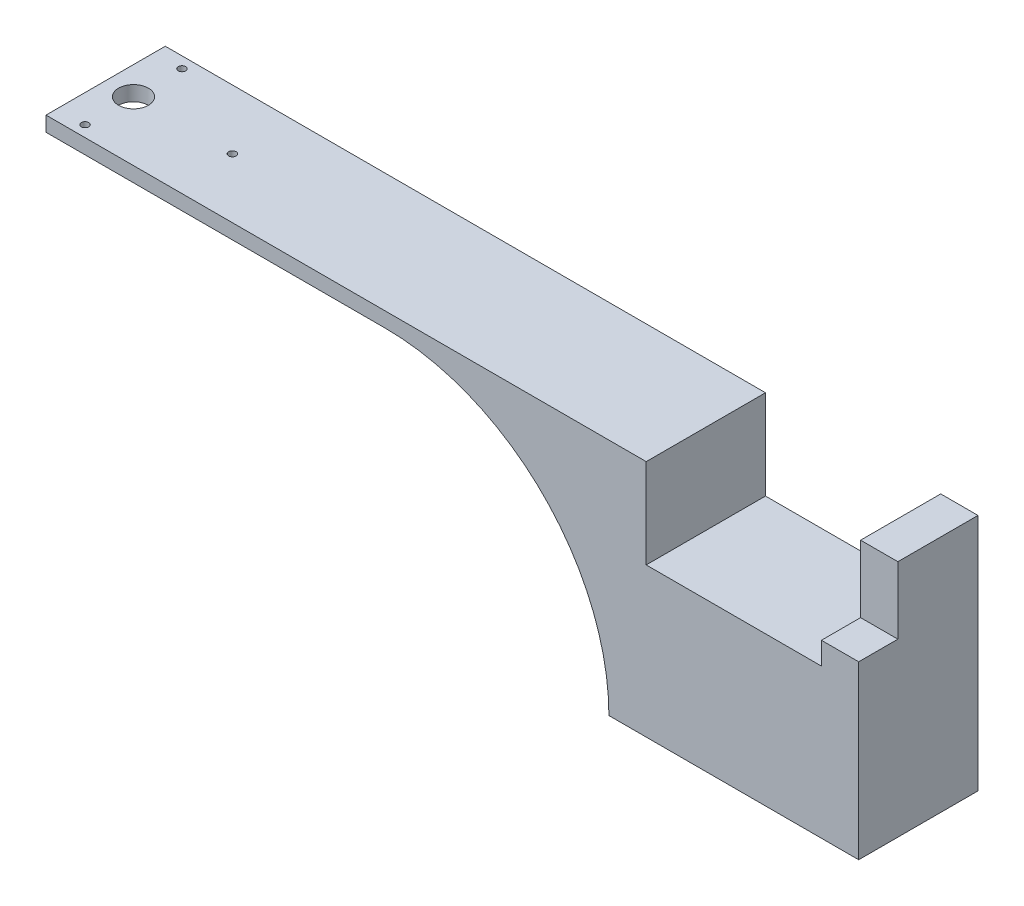
ISO-10303-21;
HEADER;
FILE_DESCRIPTION(('STEP AP214'),'2;1');
FILE_NAME('part.step','',(''),(''),'','','');
FILE_SCHEMA(('AUTOMOTIVE_DESIGN { 1 0 10303 214 1 1 1 1 }'));
ENDSEC;
DATA;
#1=APPLICATION_CONTEXT('core data for automotive mechanical design processes');
#2=APPLICATION_PROTOCOL_DEFINITION('international standard','automotive_design',2000,#1);
#3=PRODUCT_CONTEXT('',#1,'mechanical');
#4=PRODUCT('Part','Part','',(#3));
#5=PRODUCT_RELATED_PRODUCT_CATEGORY('part','',(#4));
#6=PRODUCT_DEFINITION_FORMATION('','',#4);
#7=PRODUCT_DEFINITION_CONTEXT('part definition',#1,'design');
#8=PRODUCT_DEFINITION('design','',#6,#7);
#9=PRODUCT_DEFINITION_SHAPE('','',#8);
#10=(LENGTH_UNIT() NAMED_UNIT(*) SI_UNIT(.MILLI.,.METRE.));
#11=(NAMED_UNIT(*) PLANE_ANGLE_UNIT() SI_UNIT($,.RADIAN.));
#12=(NAMED_UNIT(*) SI_UNIT($,.STERADIAN.) SOLID_ANGLE_UNIT());
#13=UNCERTAINTY_MEASURE_WITH_UNIT(LENGTH_MEASURE(1.E-05),#10,'distance_accuracy_value','');
#14=(GEOMETRIC_REPRESENTATION_CONTEXT(3) GLOBAL_UNCERTAINTY_ASSIGNED_CONTEXT((#13)) GLOBAL_UNIT_ASSIGNED_CONTEXT((#10,
#11,#12)) REPRESENTATION_CONTEXT('',''));
#15=CARTESIAN_POINT('',(0.,0.,0.));
#16=DIRECTION('',(0.,0.,1.));
#17=DIRECTION('',(1.,0.,0.));
#18=AXIS2_PLACEMENT_3D('',#15,#16,#17);
#19=CARTESIAN_POINT('',(0.,32.,0.));
#20=DIRECTION('',(0.,1.,0.));
#21=DIRECTION('',(0.,0.,1.));
#22=AXIS2_PLACEMENT_3D('',#19,#20,#21);
#23=PLANE('',#22);
#24=CARTESIAN_POINT('',(-88.5159746639612,32.,-6.5));
#25=DIRECTION('',(0.,1.,0.));
#26=DIRECTION('',(0.,0.,1.));
#27=AXIS2_PLACEMENT_3D('',#24,#25,#26);
#28=CIRCLE('',#27,0.499999999999999);
#29=CARTESIAN_POINT('',(-88.5159746639612,32.,-6.));
#30=VERTEX_POINT('',#29);
#31=EDGE_CURVE('E223',#30,#30,#28,.T.);
#32=ORIENTED_EDGE('',*,*,#31,.F.);
#33=EDGE_LOOP('',(#32));
#34=FACE_BOUND('',#33,.T.);
#35=CARTESIAN_POINT('',(-88.5159746639612,32.,0.));
#36=DIRECTION('',(0.,1.,0.));
#37=DIRECTION('',(0.,0.,1.));
#38=AXIS2_PLACEMENT_3D('',#35,#36,#37);
#39=CIRCLE('',#38,2.);
#40=CARTESIAN_POINT('',(-88.5159746639612,32.,2.));
#41=VERTEX_POINT('',#40);
#42=EDGE_CURVE('E608',#41,#41,#39,.T.);
#43=ORIENTED_EDGE('',*,*,#42,.F.);
#44=EDGE_LOOP('',(#43));
#45=FACE_BOUND('',#44,.T.);
#46=CARTESIAN_POINT('',(-88.5159746639612,32.,6.5));
#47=DIRECTION('',(0.,1.,0.));
#48=DIRECTION('',(0.,0.,-1.));
#49=AXIS2_PLACEMENT_3D('',#46,#47,#48);
#50=CIRCLE('',#49,0.499999999999999);
#51=CARTESIAN_POINT('',(-88.5159746639612,32.,6.));
#52=VERTEX_POINT('',#51);
#53=EDGE_CURVE('E337',#52,#52,#50,.T.);
#54=ORIENTED_EDGE('',*,*,#53,.F.);
#55=EDGE_LOOP('',(#54));
#56=FACE_BOUND('',#55,.T.);
#57=CARTESIAN_POINT('',(-75.2500000000001,32.,0.));
#58=DIRECTION('',(0.,1.,0.));
#59=DIRECTION('',(0.,0.,1.));
#60=AXIS2_PLACEMENT_3D('',#57,#58,#59);
#61=CIRCLE('',#60,0.499999999999999);
#62=CARTESIAN_POINT('',(-75.2500000000001,32.,0.499999999999999));
#63=VERTEX_POINT('',#62);
#64=EDGE_CURVE('E598',#63,#63,#61,.T.);
#65=ORIENTED_EDGE('',*,*,#64,.F.);
#66=EDGE_LOOP('',(#65));
#67=FACE_BOUND('',#66,.T.);
#68=DIRECTION('',(0.,0.,1.));
#69=VECTOR('',#68,1.);
#70=CARTESIAN_POINT('',(-11.75,32.,8.));
#71=LINE('',#70,#69);
#72=CARTESIAN_POINT('',(-11.75,32.,-8.));
#73=VERTEX_POINT('',#72);
#74=CARTESIAN_POINT('',(-11.75,32.,8.));
#75=VERTEX_POINT('',#74);
#76=EDGE_CURVE('E254',#73,#75,#71,.T.);
#77=ORIENTED_EDGE('',*,*,#76,.F.);
#78=DIRECTION('',(-1.,0.,0.));
#79=VECTOR('',#78,1.);
#80=CARTESIAN_POINT('',(16.75,32.,-8.));
#81=LINE('',#80,#79);
#82=CARTESIAN_POINT('',(-92.2500000000001,32.,-7.99999999999997));
#83=VERTEX_POINT('',#82);
#84=EDGE_CURVE('E173',#73,#83,#81,.T.);
#85=ORIENTED_EDGE('',*,*,#84,.T.);
#86=DIRECTION('',(0.,0.,-1.));
#87=VECTOR('',#86,1.);
#88=CARTESIAN_POINT('',(-92.2500000000001,32.,-7.99999999999997));
#89=LINE('',#88,#87);
#90=CARTESIAN_POINT('',(-92.2500000000001,32.,8.00000000000003));
#91=VERTEX_POINT('',#90);
#92=EDGE_CURVE('E260',#91,#83,#89,.T.);
#93=ORIENTED_EDGE('',*,*,#92,.F.);
#94=DIRECTION('',(1.,0.,0.));
#95=VECTOR('',#94,1.);
#96=CARTESIAN_POINT('',(16.75,32.,7.99999999999999));
#97=LINE('',#96,#95);
#98=EDGE_CURVE('E179',#91,#75,#97,.T.);
#99=ORIENTED_EDGE('',*,*,#98,.T.);
#100=EDGE_LOOP('',(#77,#85,#93,#99));
#101=FACE_BOUND('',#100,.T.);
#102=ADVANCED_FACE('F39',(#34,#45,#56,#67,#101),#23,.T.);
#103=CARTESIAN_POINT('',(16.75,32.,7.99999999999999));
#104=DIRECTION('',(-1.,0.,0.));
#105=DIRECTION('',(0.,0.,1.));
#106=AXIS2_PLACEMENT_3D('',#103,#104,#105);
#107=PLANE('',#106);
#108=DIRECTION('',(0.,0.,-1.));
#109=VECTOR('',#108,1.);
#110=CARTESIAN_POINT('',(16.75,32.,7.99999999999999));
#111=LINE('',#110,#109);
#112=CARTESIAN_POINT('',(16.75,32.,2.74736434071692));
#113=VERTEX_POINT('',#112);
#114=CARTESIAN_POINT('',(16.75,32.,-8.));
#115=VERTEX_POINT('',#114);
#116=EDGE_CURVE('E170',#113,#115,#111,.T.);
#117=ORIENTED_EDGE('',*,*,#116,.F.);
#118=DIRECTION('',(0.,1.,0.));
#119=VECTOR('',#118,1.);
#120=CARTESIAN_POINT('',(16.75,23.,2.74736434071692));
#121=LINE('',#120,#119);
#122=CARTESIAN_POINT('',(16.75,23.,2.74736434071692));
#123=VERTEX_POINT('',#122);
#124=EDGE_CURVE('E298',#123,#113,#121,.T.);
#125=ORIENTED_EDGE('',*,*,#124,.F.);
#126=DIRECTION('',(0.,0.,-1.));
#127=VECTOR('',#126,1.);
#128=CARTESIAN_POINT('',(16.75,23.,7.99999999999999));
#129=LINE('',#128,#127);
#130=CARTESIAN_POINT('',(16.75,23.,7.99999999999999));
#131=VERTEX_POINT('',#130);
#132=EDGE_CURVE('E150',#131,#123,#129,.T.);
#133=ORIENTED_EDGE('',*,*,#132,.F.);
#134=DIRECTION('',(0.,-1.,0.));
#135=VECTOR('',#134,1.);
#136=CARTESIAN_POINT('',(16.75,32.,7.99999999999999));
#137=LINE('',#136,#135);
#138=CARTESIAN_POINT('',(16.75,0.,7.99999999999999));
#139=VERTEX_POINT('',#138);
#140=EDGE_CURVE('E148',#131,#139,#137,.T.);
#141=ORIENTED_EDGE('',*,*,#140,.T.);
#142=DIRECTION('',(0.,0.,-1.));
#143=VECTOR('',#142,1.);
#144=CARTESIAN_POINT('',(16.75,0.,7.99999999999999));
#145=LINE('',#144,#143);
#146=CARTESIAN_POINT('',(16.75,0.,-8.));
#147=VERTEX_POINT('',#146);
#148=EDGE_CURVE('E183',#139,#147,#145,.T.);
#149=ORIENTED_EDGE('',*,*,#148,.T.);
#150=DIRECTION('',(0.,-1.,0.));
#151=VECTOR('',#150,1.);
#152=CARTESIAN_POINT('',(16.75,32.,-8.));
#153=LINE('',#152,#151);
#154=EDGE_CURVE('E197',#115,#147,#153,.T.);
#155=ORIENTED_EDGE('',*,*,#154,.F.);
#156=EDGE_LOOP('',(#117,#125,#133,#141,#149,#155));
#157=FACE_BOUND('',#156,.T.);
#158=ADVANCED_FACE('F317',(#157),#107,.F.);
#159=CARTESIAN_POINT('',(16.75,32.,-8.));
#160=DIRECTION('',(0.,0.,1.));
#161=DIRECTION('',(1.,0.,0.));
#162=AXIS2_PLACEMENT_3D('',#159,#160,#161);
#163=PLANE('',#162);
#164=CARTESIAN_POINT('',(13.65,26.,-8.));
#165=DIRECTION('',(0.,0.,1.));
#166=DIRECTION('',(1.,0.,0.));
#167=AXIS2_PLACEMENT_3D('',#164,#165,#166);
#168=CIRCLE('',#167,0.8);
#169=CARTESIAN_POINT('',(14.45,26.,-8.));
#170=VERTEX_POINT('',#169);
#171=EDGE_CURVE('E324',#170,#170,#168,.T.);
#172=ORIENTED_EDGE('',*,*,#171,.T.);
#173=EDGE_LOOP('',(#172));
#174=FACE_BOUND('',#173,.T.);
#175=CARTESIAN_POINT('',(-13.65,26.,-8.));
#176=DIRECTION('',(0.,0.,1.));
#177=DIRECTION('',(1.,0.,0.));
#178=AXIS2_PLACEMENT_3D('',#175,#176,#177);
#179=CIRCLE('',#178,0.8);
#180=CARTESIAN_POINT('',(-12.85,26.,-8.));
#181=VERTEX_POINT('',#180);
#182=EDGE_CURVE('E334',#181,#181,#179,.T.);
#183=ORIENTED_EDGE('',*,*,#182,.T.);
#184=EDGE_LOOP('',(#183));
#185=FACE_BOUND('',#184,.T.);
#186=ORIENTED_EDGE('',*,*,#84,.F.);
#187=DIRECTION('',(0.,1.,0.));
#188=VECTOR('',#187,1.);
#189=CARTESIAN_POINT('',(-11.75,20.,-8.));
#190=LINE('',#189,#188);
#191=CARTESIAN_POINT('',(-11.75,20.,-8.));
#192=VERTEX_POINT('',#191);
#193=EDGE_CURVE('E163',#192,#73,#190,.T.);
#194=ORIENTED_EDGE('',*,*,#193,.F.);
#195=DIRECTION('',(-1.,0.,0.));
#196=VECTOR('',#195,1.);
#197=CARTESIAN_POINT('',(-11.75,20.,-8.));
#198=LINE('',#197,#196);
#199=CARTESIAN_POINT('',(11.75,20.,-8.));
#200=VERTEX_POINT('',#199);
#201=EDGE_CURVE('E166',#200,#192,#198,.T.);
#202=ORIENTED_EDGE('',*,*,#201,.F.);
#203=DIRECTION('',(0.,1.,0.));
#204=VECTOR('',#203,1.);
#205=CARTESIAN_POINT('',(11.75,20.,-8.));
#206=LINE('',#205,#204);
#207=CARTESIAN_POINT('',(11.75,32.,-8.));
#208=VERTEX_POINT('',#207);
#209=EDGE_CURVE('E157',#200,#208,#206,.T.);
#210=ORIENTED_EDGE('',*,*,#209,.T.);
#211=EDGE_CURVE('E175',#115,#208,#81,.T.);
#212=ORIENTED_EDGE('',*,*,#211,.F.);
#213=ORIENTED_EDGE('',*,*,#154,.T.);
#214=DIRECTION('',(-1.,0.,0.));
#215=VECTOR('',#214,1.);
#216=CARTESIAN_POINT('',(16.75,0.,-8.));
#217=LINE('',#216,#215);
#218=CARTESIAN_POINT('',(-16.75,0.,-8.00000000000001));
#219=VERTEX_POINT('',#218);
#220=EDGE_CURVE('E187',#147,#219,#217,.T.);
#221=ORIENTED_EDGE('',*,*,#220,.T.);
#222=CARTESIAN_POINT('',(-46.75,0.,-8.00000000000001));
#223=DIRECTION('',(0.,0.,1.));
#224=DIRECTION('',(1.,0.,0.));
#225=AXIS2_PLACEMENT_3D('',#222,#223,#224);
#226=CIRCLE('',#225,30.);
#227=CARTESIAN_POINT('',(-46.75,30.,-7.99999999999999));
#228=VERTEX_POINT('',#227);
#229=EDGE_CURVE('E11',#219,#228,#226,.T.);
#230=ORIENTED_EDGE('',*,*,#229,.T.);
#231=DIRECTION('',(1.,0.,0.));
#232=VECTOR('',#231,1.);
#233=CARTESIAN_POINT('',(-92.2500000000001,30.,-7.99999999999997));
#234=LINE('',#233,#232);
#235=CARTESIAN_POINT('',(-92.2500000000001,30.,-7.99999999999997));
#236=VERTEX_POINT('',#235);
#237=EDGE_CURVE('E249',#236,#228,#234,.T.);
#238=ORIENTED_EDGE('',*,*,#237,.F.);
#239=DIRECTION('',(0.,-1.,0.));
#240=VECTOR('',#239,1.);
#241=CARTESIAN_POINT('',(-92.2500000000001,32.,-7.99999999999997));
#242=LINE('',#241,#240);
#243=EDGE_CURVE('E288',#83,#236,#242,.T.);
#244=ORIENTED_EDGE('',*,*,#243,.F.);
#245=EDGE_LOOP('',(#186,#194,#202,#210,#212,#213,#221,#230,#238,#244));
#246=FACE_BOUND('',#245,.T.);
#247=ADVANCED_FACE('F287',(#174,#185,#246),#163,.F.);
#248=CARTESIAN_POINT('',(16.75,32.,7.99999999999999));
#249=DIRECTION('',(0.,0.,-1.));
#250=DIRECTION('',(-1.,0.,0.));
#251=AXIS2_PLACEMENT_3D('',#248,#249,#250);
#252=PLANE('',#251);
#253=ORIENTED_EDGE('',*,*,#140,.F.);
#254=DIRECTION('',(1.,0.,0.));
#255=VECTOR('',#254,1.);
#256=CARTESIAN_POINT('',(11.75,23.,7.99999999999999));
#257=LINE('',#256,#255);
#258=CARTESIAN_POINT('',(11.75,23.,7.99999999999999));
#259=VERTEX_POINT('',#258);
#260=EDGE_CURVE('E130',#259,#131,#257,.T.);
#261=ORIENTED_EDGE('',*,*,#260,.F.);
#262=DIRECTION('',(0.,1.,0.));
#263=VECTOR('',#262,1.);
#264=CARTESIAN_POINT('',(11.75,20.,8.));
#265=LINE('',#264,#263);
#266=CARTESIAN_POINT('',(11.75,20.,8.));
#267=VERTEX_POINT('',#266);
#268=EDGE_CURVE('E146',#267,#259,#265,.T.);
#269=ORIENTED_EDGE('',*,*,#268,.F.);
#270=DIRECTION('',(1.,0.,0.));
#271=VECTOR('',#270,1.);
#272=CARTESIAN_POINT('',(-11.75,20.,8.));
#273=LINE('',#272,#271);
#274=CARTESIAN_POINT('',(-11.75,20.,8.));
#275=VERTEX_POINT('',#274);
#276=EDGE_CURVE('E268',#275,#267,#273,.T.);
#277=ORIENTED_EDGE('',*,*,#276,.F.);
#278=DIRECTION('',(0.,1.,0.));
#279=VECTOR('',#278,1.);
#280=CARTESIAN_POINT('',(-11.75,20.,8.));
#281=LINE('',#280,#279);
#282=EDGE_CURVE('E158',#275,#75,#281,.T.);
#283=ORIENTED_EDGE('',*,*,#282,.T.);
#284=ORIENTED_EDGE('',*,*,#98,.F.);
#285=DIRECTION('',(0.,1.,0.));
#286=VECTOR('',#285,1.);
#287=CARTESIAN_POINT('',(-92.2500000000001,32.,8.00000000000003));
#288=LINE('',#287,#286);
#289=CARTESIAN_POINT('',(-92.2500000000001,30.,8.00000000000003));
#290=VERTEX_POINT('',#289);
#291=EDGE_CURVE('E296',#290,#91,#288,.T.);
#292=ORIENTED_EDGE('',*,*,#291,.F.);
#293=DIRECTION('',(1.,0.,0.));
#294=VECTOR('',#293,1.);
#295=CARTESIAN_POINT('',(-92.2500000000001,30.,8.00000000000003));
#296=LINE('',#295,#294);
#297=CARTESIAN_POINT('',(-46.75,30.,8.00000000000001));
#298=VERTEX_POINT('',#297);
#299=EDGE_CURVE('E243',#290,#298,#296,.T.);
#300=ORIENTED_EDGE('',*,*,#299,.T.);
#301=CARTESIAN_POINT('',(-46.75,0.,8.));
#302=DIRECTION('',(0.,0.,-1.));
#303=DIRECTION('',(-1.,0.,0.));
#304=AXIS2_PLACEMENT_3D('',#301,#302,#303);
#305=CIRCLE('',#304,30.);
#306=CARTESIAN_POINT('',(-16.75,0.,8.));
#307=VERTEX_POINT('',#306);
#308=EDGE_CURVE('E48',#298,#307,#305,.T.);
#309=ORIENTED_EDGE('',*,*,#308,.T.);
#310=DIRECTION('',(1.,0.,0.));
#311=VECTOR('',#310,1.);
#312=CARTESIAN_POINT('',(16.75,0.,7.99999999999999));
#313=LINE('',#312,#311);
#314=EDGE_CURVE('E174',#307,#139,#313,.T.);
#315=ORIENTED_EDGE('',*,*,#314,.T.);
#316=EDGE_LOOP('',(#253,#261,#269,#277,#283,#284,#292,#300,#309,#315));
#317=FACE_BOUND('',#316,.T.);
#318=ADVANCED_FACE('F144',(#317),#252,.F.);
#319=DIRECTION('',(-1.,0.,0.));
#320=VECTOR('',#319,1.);
#321=CARTESIAN_POINT('',(11.75,32.,2.74736434071692));
#322=LINE('',#321,#320);
#323=CARTESIAN_POINT('',(11.75,32.,2.74736434071692));
#324=VERTEX_POINT('',#323);
#325=EDGE_CURVE('E139',#113,#324,#322,.T.);
#326=ORIENTED_EDGE('',*,*,#325,.F.);
#327=ORIENTED_EDGE('',*,*,#116,.T.);
#328=ORIENTED_EDGE('',*,*,#211,.T.);
#329=DIRECTION('',(0.,0.,-1.));
#330=VECTOR('',#329,1.);
#331=CARTESIAN_POINT('',(11.75,32.,8.));
#332=LINE('',#331,#330);
#333=EDGE_CURVE('E258',#324,#208,#332,.T.);
#334=ORIENTED_EDGE('',*,*,#333,.F.);
#335=EDGE_LOOP('',(#326,#327,#328,#334));
#336=FACE_BOUND('',#335,.T.);
#337=ADVANCED_FACE('F313',(#336),#23,.T.);
#338=CARTESIAN_POINT('',(0.,0.,0.));
#339=DIRECTION('',(0.,1.,0.));
#340=DIRECTION('',(0.,0.,1.));
#341=AXIS2_PLACEMENT_3D('',#338,#339,#340);
#342=PLANE('',#341);
#343=CARTESIAN_POINT('',(-15.8132407199219,0.,-7.12248893005096));
#344=DIRECTION('',(0.,1.,0.));
#345=DIRECTION('',(0.,0.,1.));
#346=AXIS2_PLACEMENT_3D('',#343,#344,#345);
#347=CIRCLE('',#346,0.499999999999999);
#348=CARTESIAN_POINT('',(-15.8132407199219,0.,-6.62248893005096));
#349=VERTEX_POINT('',#348);
#350=EDGE_CURVE('E213',#349,#349,#347,.F.);
#351=ORIENTED_EDGE('',*,*,#350,.F.);
#352=EDGE_LOOP('',(#351));
#353=FACE_BOUND('',#352,.T.);
#354=CARTESIAN_POINT('',(15.8688292315219,0.,-7.12248893005096));
#355=DIRECTION('',(0.,1.,0.));
#356=DIRECTION('',(0.,0.,1.));
#357=AXIS2_PLACEMENT_3D('',#354,#355,#356);
#358=CIRCLE('',#357,0.500000000000001);
#359=CARTESIAN_POINT('',(15.8688292315219,0.,-6.62248893005096));
#360=VERTEX_POINT('',#359);
#361=EDGE_CURVE('E209',#360,#360,#358,.F.);
#362=ORIENTED_EDGE('',*,*,#361,.F.);
#363=EDGE_LOOP('',(#362));
#364=FACE_BOUND('',#363,.T.);
#365=CARTESIAN_POINT('',(15.8688292315219,0.,7.12248893005096));
#366=DIRECTION('',(0.,1.,0.));
#367=DIRECTION('',(0.,0.,1.));
#368=AXIS2_PLACEMENT_3D('',#365,#366,#367);
#369=CIRCLE('',#368,0.500000000000001);
#370=CARTESIAN_POINT('',(15.8688292315219,0.,7.62248893005096));
#371=VERTEX_POINT('',#370);
#372=EDGE_CURVE('E205',#371,#371,#369,.F.);
#373=ORIENTED_EDGE('',*,*,#372,.F.);
#374=EDGE_LOOP('',(#373));
#375=FACE_BOUND('',#374,.T.);
#376=CARTESIAN_POINT('',(-15.8132407199219,0.,7.12248893005096));
#377=DIRECTION('',(0.,1.,0.));
#378=DIRECTION('',(0.,0.,1.));
#379=AXIS2_PLACEMENT_3D('',#376,#377,#378);
#380=CIRCLE('',#379,0.499999999999999);
#381=CARTESIAN_POINT('',(-15.8132407199219,0.,7.62248893005096));
#382=VERTEX_POINT('',#381);
#383=EDGE_CURVE('E201',#382,#382,#380,.F.);
#384=ORIENTED_EDGE('',*,*,#383,.F.);
#385=EDGE_LOOP('',(#384));
#386=FACE_BOUND('',#385,.T.);
#387=ORIENTED_EDGE('',*,*,#148,.F.);
#388=ORIENTED_EDGE('',*,*,#314,.F.);
#389=DIRECTION('',(0.,0.,1.));
#390=VECTOR('',#389,1.);
#391=CARTESIAN_POINT('',(-16.75,0.,8.));
#392=LINE('',#391,#390);
#393=EDGE_CURVE('E190',#219,#307,#392,.T.);
#394=ORIENTED_EDGE('',*,*,#393,.F.);
#395=ORIENTED_EDGE('',*,*,#220,.F.);
#396=EDGE_LOOP('',(#387,#388,#394,#395));
#397=FACE_BOUND('',#396,.T.);
#398=ADVANCED_FACE('F246',(#353,#364,#375,#386,#397),#342,.F.);
#399=CARTESIAN_POINT('',(-11.75,20.,8.));
#400=DIRECTION('',(-1.,0.,0.));
#401=DIRECTION('',(0.,0.,1.));
#402=AXIS2_PLACEMENT_3D('',#399,#400,#401);
#403=PLANE('',#402);
#404=ORIENTED_EDGE('',*,*,#76,.T.);
#405=ORIENTED_EDGE('',*,*,#282,.F.);
#406=DIRECTION('',(0.,0.,1.));
#407=VECTOR('',#406,1.);
#408=CARTESIAN_POINT('',(-11.75,20.,8.));
#409=LINE('',#408,#407);
#410=EDGE_CURVE('E264',#192,#275,#409,.T.);
#411=ORIENTED_EDGE('',*,*,#410,.F.);
#412=ORIENTED_EDGE('',*,*,#193,.T.);
#413=EDGE_LOOP('',(#404,#405,#411,#412));
#414=FACE_BOUND('',#413,.T.);
#415=ADVANCED_FACE('F281',(#414),#403,.F.);
#416=CARTESIAN_POINT('',(11.75,20.,8.));
#417=DIRECTION('',(1.,0.,0.));
#418=DIRECTION('',(0.,0.,-1.));
#419=AXIS2_PLACEMENT_3D('',#416,#417,#418);
#420=PLANE('',#419);
#421=DIRECTION('',(0.,0.,1.));
#422=VECTOR('',#421,1.);
#423=CARTESIAN_POINT('',(11.75,23.,7.99999999999999));
#424=LINE('',#423,#422);
#425=CARTESIAN_POINT('',(11.75,23.,2.74736434071692));
#426=VERTEX_POINT('',#425);
#427=EDGE_CURVE('E127',#426,#259,#424,.T.);
#428=ORIENTED_EDGE('',*,*,#427,.F.);
#429=DIRECTION('',(0.,1.,0.));
#430=VECTOR('',#429,1.);
#431=CARTESIAN_POINT('',(11.75,23.,2.74736434071692));
#432=LINE('',#431,#430);
#433=EDGE_CURVE('E292',#426,#324,#432,.T.);
#434=ORIENTED_EDGE('',*,*,#433,.T.);
#435=ORIENTED_EDGE('',*,*,#333,.T.);
#436=ORIENTED_EDGE('',*,*,#209,.F.);
#437=DIRECTION('',(0.,0.,-1.));
#438=VECTOR('',#437,1.);
#439=CARTESIAN_POINT('',(11.75,20.,8.));
#440=LINE('',#439,#438);
#441=EDGE_CURVE('E154',#267,#200,#440,.T.);
#442=ORIENTED_EDGE('',*,*,#441,.F.);
#443=ORIENTED_EDGE('',*,*,#268,.T.);
#444=EDGE_LOOP('',(#428,#434,#435,#436,#442,#443));
#445=FACE_BOUND('',#444,.T.);
#446=ADVANCED_FACE('F152',(#445),#420,.F.);
#447=CARTESIAN_POINT('',(0.,20.,0.));
#448=DIRECTION('',(0.,-1.,0.));
#449=DIRECTION('',(0.,0.,-1.));
#450=AXIS2_PLACEMENT_3D('',#447,#448,#449);
#451=PLANE('',#450);
#452=ORIENTED_EDGE('',*,*,#410,.T.);
#453=ORIENTED_EDGE('',*,*,#276,.T.);
#454=ORIENTED_EDGE('',*,*,#441,.T.);
#455=ORIENTED_EDGE('',*,*,#201,.T.);
#456=EDGE_LOOP('',(#452,#453,#454,#455));
#457=FACE_BOUND('',#456,.T.);
#458=ADVANCED_FACE('F307',(#457),#451,.F.);
#459=CARTESIAN_POINT('',(-15.8132407199219,0.,-7.12248893005096));
#460=DIRECTION('',(0.,1.,0.));
#461=DIRECTION('',(0.,0.,1.));
#462=AXIS2_PLACEMENT_3D('',#459,#460,#461);
#463=SPHERICAL_SURFACE('',#462,0.5);
#464=ORIENTED_EDGE('',*,*,#350,.T.);
#465=EDGE_LOOP('',(#464));
#466=FACE_BOUND('',#465,.T.);
#467=ADVANCED_FACE('F385',(#466),#463,.T.);
#468=CARTESIAN_POINT('',(15.8688292315219,0.,-7.12248893005096));
#469=DIRECTION('',(0.,1.,0.));
#470=DIRECTION('',(0.,0.,1.));
#471=AXIS2_PLACEMENT_3D('',#468,#469,#470);
#472=SPHERICAL_SURFACE('',#471,0.5);
#473=ORIENTED_EDGE('',*,*,#361,.T.);
#474=EDGE_LOOP('',(#473));
#475=FACE_BOUND('',#474,.T.);
#476=ADVANCED_FACE('F388',(#475),#472,.T.);
#477=CARTESIAN_POINT('',(15.8688292315219,0.,7.12248893005096));
#478=DIRECTION('',(0.,-1.,0.));
#479=DIRECTION('',(0.,0.,-1.));
#480=AXIS2_PLACEMENT_3D('',#477,#478,#479);
#481=SPHERICAL_SURFACE('',#480,0.5);
#482=ORIENTED_EDGE('',*,*,#372,.T.);
#483=EDGE_LOOP('',(#482));
#484=FACE_BOUND('',#483,.T.);
#485=ADVANCED_FACE('F392',(#484),#481,.T.);
#486=CARTESIAN_POINT('',(-15.8132407199219,0.,7.12248893005096));
#487=DIRECTION('',(0.,-1.,0.));
#488=DIRECTION('',(0.,0.,-1.));
#489=AXIS2_PLACEMENT_3D('',#486,#487,#488);
#490=SPHERICAL_SURFACE('',#489,0.5);
#491=ORIENTED_EDGE('',*,*,#383,.T.);
#492=EDGE_LOOP('',(#491));
#493=FACE_BOUND('',#492,.T.);
#494=ADVANCED_FACE('F395',(#493),#490,.T.);
#495=CARTESIAN_POINT('',(-92.2500000000001,30.,-7.99999999999997));
#496=DIRECTION('',(0.,1.,0.));
#497=DIRECTION('',(0.,0.,1.));
#498=AXIS2_PLACEMENT_3D('',#495,#496,#497);
#499=PLANE('',#498);
#500=CARTESIAN_POINT('',(-88.5159746639612,30.,-6.5));
#501=DIRECTION('',(0.,1.,0.));
#502=DIRECTION('',(0.,0.,1.));
#503=AXIS2_PLACEMENT_3D('',#500,#501,#502);
#504=CIRCLE('',#503,0.499999999999999);
#505=CARTESIAN_POINT('',(-88.5159746639612,30.,-6.));
#506=VERTEX_POINT('',#505);
#507=EDGE_CURVE('E231',#506,#506,#504,.T.);
#508=ORIENTED_EDGE('',*,*,#507,.T.);
#509=EDGE_LOOP('',(#508));
#510=FACE_BOUND('',#509,.T.);
#511=CARTESIAN_POINT('',(-88.5159746639612,30.,0.));
#512=DIRECTION('',(0.,1.,0.));
#513=DIRECTION('',(0.,0.,1.));
#514=AXIS2_PLACEMENT_3D('',#511,#512,#513);
#515=CIRCLE('',#514,2.);
#516=CARTESIAN_POINT('',(-88.5159746639612,30.,2.));
#517=VERTEX_POINT('',#516);
#518=EDGE_CURVE('E227',#517,#517,#515,.T.);
#519=ORIENTED_EDGE('',*,*,#518,.T.);
#520=EDGE_LOOP('',(#519));
#521=FACE_BOUND('',#520,.T.);
#522=CARTESIAN_POINT('',(-88.5159746639612,30.,6.5));
#523=DIRECTION('',(0.,1.,0.));
#524=DIRECTION('',(0.,0.,1.));
#525=AXIS2_PLACEMENT_3D('',#522,#523,#524);
#526=CIRCLE('',#525,0.499999999999999);
#527=CARTESIAN_POINT('',(-88.5159746639612,30.,7.));
#528=VERTEX_POINT('',#527);
#529=EDGE_CURVE('E222',#528,#528,#526,.T.);
#530=ORIENTED_EDGE('',*,*,#529,.T.);
#531=EDGE_LOOP('',(#530));
#532=FACE_BOUND('',#531,.T.);
#533=CARTESIAN_POINT('',(-75.2500000000001,30.,0.));
#534=DIRECTION('',(0.,1.,0.));
#535=DIRECTION('',(0.,0.,1.));
#536=AXIS2_PLACEMENT_3D('',#533,#534,#535);
#537=CIRCLE('',#536,0.499999999999999);
#538=CARTESIAN_POINT('',(-75.2500000000001,30.,0.499999999999999));
#539=VERTEX_POINT('',#538);
#540=EDGE_CURVE('E218',#539,#539,#537,.T.);
#541=ORIENTED_EDGE('',*,*,#540,.T.);
#542=EDGE_LOOP('',(#541));
#543=FACE_BOUND('',#542,.T.);
#544=ORIENTED_EDGE('',*,*,#237,.T.);
#545=DIRECTION('',(0.,0.,1.));
#546=VECTOR('',#545,1.);
#547=CARTESIAN_POINT('',(-46.75,30.,8.00000000000001));
#548=LINE('',#547,#546);
#549=EDGE_CURVE('E217',#228,#298,#548,.T.);
#550=ORIENTED_EDGE('',*,*,#549,.T.);
#551=ORIENTED_EDGE('',*,*,#299,.F.);
#552=DIRECTION('',(0.,0.,1.));
#553=VECTOR('',#552,1.);
#554=CARTESIAN_POINT('',(-92.2500000000001,30.,-7.99999999999997));
#555=LINE('',#554,#553);
#556=EDGE_CURVE('E250',#236,#290,#555,.T.);
#557=ORIENTED_EDGE('',*,*,#556,.F.);
#558=EDGE_LOOP('',(#544,#550,#551,#557));
#559=FACE_BOUND('',#558,.T.);
#560=ADVANCED_FACE('F248',(#510,#521,#532,#543,#559),#499,.F.);
#561=CARTESIAN_POINT('',(-92.2500000000001,0.,0.));
#562=DIRECTION('',(-1.,0.,0.));
#563=DIRECTION('',(0.,0.,1.));
#564=AXIS2_PLACEMENT_3D('',#561,#562,#563);
#565=PLANE('',#564);
#566=ORIENTED_EDGE('',*,*,#243,.T.);
#567=ORIENTED_EDGE('',*,*,#556,.T.);
#568=ORIENTED_EDGE('',*,*,#291,.T.);
#569=ORIENTED_EDGE('',*,*,#92,.T.);
#570=EDGE_LOOP('',(#566,#567,#568,#569));
#571=FACE_BOUND('',#570,.T.);
#572=ADVANCED_FACE('F305',(#571),#565,.T.);
#573=CARTESIAN_POINT('',(11.75,23.,2.74736434071692));
#574=DIRECTION('',(0.,0.,-1.));
#575=DIRECTION('',(-1.,0.,0.));
#576=AXIS2_PLACEMENT_3D('',#573,#574,#575);
#577=PLANE('',#576);
#578=ORIENTED_EDGE('',*,*,#325,.T.);
#579=ORIENTED_EDGE('',*,*,#433,.F.);
#580=DIRECTION('',(-1.,0.,0.));
#581=VECTOR('',#580,1.);
#582=CARTESIAN_POINT('',(11.75,23.,2.74736434071692));
#583=LINE('',#582,#581);
#584=EDGE_CURVE('E133',#123,#426,#583,.T.);
#585=ORIENTED_EDGE('',*,*,#584,.F.);
#586=ORIENTED_EDGE('',*,*,#124,.T.);
#587=EDGE_LOOP('',(#578,#579,#585,#586));
#588=FACE_BOUND('',#587,.T.);
#589=ADVANCED_FACE('F409',(#588),#577,.F.);
#590=CARTESIAN_POINT('',(0.,23.,0.));
#591=DIRECTION('',(0.,-1.,0.));
#592=DIRECTION('',(0.,0.,-1.));
#593=AXIS2_PLACEMENT_3D('',#590,#591,#592);
#594=PLANE('',#593);
#595=ORIENTED_EDGE('',*,*,#427,.T.);
#596=ORIENTED_EDGE('',*,*,#260,.T.);
#597=ORIENTED_EDGE('',*,*,#132,.T.);
#598=ORIENTED_EDGE('',*,*,#584,.T.);
#599=EDGE_LOOP('',(#595,#596,#597,#598));
#600=FACE_BOUND('',#599,.T.);
#601=ADVANCED_FACE('F129',(#600),#594,.F.);
#602=CARTESIAN_POINT('',(-13.65,26.,-8.));
#603=DIRECTION('',(0.,0.,1.));
#604=DIRECTION('',(1.,0.,0.));
#605=AXIS2_PLACEMENT_3D('',#602,#603,#604);
#606=CYLINDRICAL_SURFACE('',#605,0.8);
#607=ORIENTED_EDGE('',*,*,#182,.F.);
#608=EDGE_LOOP('',(#607));
#609=FACE_BOUND('',#608,.T.);
#610=CARTESIAN_POINT('',(-13.65,26.,0.));
#611=DIRECTION('',(0.,0.,1.));
#612=DIRECTION('',(1.,0.,0.));
#613=AXIS2_PLACEMENT_3D('',#610,#611,#612);
#614=CIRCLE('',#613,0.8);
#615=CARTESIAN_POINT('',(-12.85,26.,0.));
#616=VERTEX_POINT('',#615);
#617=EDGE_CURVE('E235',#616,#616,#614,.T.);
#618=ORIENTED_EDGE('',*,*,#617,.T.);
#619=EDGE_LOOP('',(#618));
#620=FACE_BOUND('',#619,.T.);
#621=ADVANCED_FACE('F347',(#609,#620),#606,.F.);
#622=CARTESIAN_POINT('',(-13.65,26.,0.));
#623=DIRECTION('',(0.,0.,1.));
#624=DIRECTION('',(1.,0.,0.));
#625=AXIS2_PLACEMENT_3D('',#622,#623,#624);
#626=PLANE('',#625);
#627=ORIENTED_EDGE('',*,*,#617,.F.);
#628=EDGE_LOOP('',(#627));
#629=FACE_BOUND('',#628,.T.);
#630=ADVANCED_FACE('F349',(#629),#626,.F.);
#631=CARTESIAN_POINT('',(13.65,26.,-8.));
#632=DIRECTION('',(0.,0.,1.));
#633=DIRECTION('',(1.,0.,0.));
#634=AXIS2_PLACEMENT_3D('',#631,#632,#633);
#635=CYLINDRICAL_SURFACE('',#634,0.8);
#636=ORIENTED_EDGE('',*,*,#171,.F.);
#637=EDGE_LOOP('',(#636));
#638=FACE_BOUND('',#637,.T.);
#639=CARTESIAN_POINT('',(13.65,26.,0.));
#640=DIRECTION('',(0.,0.,1.));
#641=DIRECTION('',(1.,0.,0.));
#642=AXIS2_PLACEMENT_3D('',#639,#640,#641);
#643=CIRCLE('',#642,0.8);
#644=CARTESIAN_POINT('',(14.45,26.,0.));
#645=VERTEX_POINT('',#644);
#646=EDGE_CURVE('E328',#645,#645,#643,.T.);
#647=ORIENTED_EDGE('',*,*,#646,.T.);
#648=EDGE_LOOP('',(#647));
#649=FACE_BOUND('',#648,.T.);
#650=ADVANCED_FACE('F351',(#638,#649),#635,.F.);
#651=CARTESIAN_POINT('',(13.65,26.,0.));
#652=DIRECTION('',(0.,0.,1.));
#653=DIRECTION('',(1.,0.,0.));
#654=AXIS2_PLACEMENT_3D('',#651,#652,#653);
#655=PLANE('',#654);
#656=ORIENTED_EDGE('',*,*,#646,.F.);
#657=EDGE_LOOP('',(#656));
#658=FACE_BOUND('',#657,.T.);
#659=ADVANCED_FACE('F357',(#658),#655,.F.);
#660=CARTESIAN_POINT('',(-75.2500000000001,24.,0.));
#661=DIRECTION('',(0.,1.,0.));
#662=DIRECTION('',(0.,0.,1.));
#663=AXIS2_PLACEMENT_3D('',#660,#661,#662);
#664=CYLINDRICAL_SURFACE('',#663,0.499999999999999);
#665=ORIENTED_EDGE('',*,*,#64,.T.);
#666=EDGE_LOOP('',(#665));
#667=FACE_BOUND('',#666,.T.);
#668=ORIENTED_EDGE('',*,*,#540,.F.);
#669=EDGE_LOOP('',(#668));
#670=FACE_BOUND('',#669,.T.);
#671=ADVANCED_FACE('F539',(#667,#670),#664,.F.);
#672=CARTESIAN_POINT('',(-88.5159746639612,24.,6.5));
#673=DIRECTION('',(0.,1.,0.));
#674=DIRECTION('',(0.,0.,1.));
#675=AXIS2_PLACEMENT_3D('',#672,#673,#674);
#676=CYLINDRICAL_SURFACE('',#675,0.499999999999999);
#677=ORIENTED_EDGE('',*,*,#53,.T.);
#678=EDGE_LOOP('',(#677));
#679=FACE_BOUND('',#678,.T.);
#680=ORIENTED_EDGE('',*,*,#529,.F.);
#681=EDGE_LOOP('',(#680));
#682=FACE_BOUND('',#681,.T.);
#683=ADVANCED_FACE('F531',(#679,#682),#676,.F.);
#684=CARTESIAN_POINT('',(-88.5159746639612,24.,0.));
#685=DIRECTION('',(0.,1.,0.));
#686=DIRECTION('',(0.,0.,1.));
#687=AXIS2_PLACEMENT_3D('',#684,#685,#686);
#688=CYLINDRICAL_SURFACE('',#687,2.);
#689=ORIENTED_EDGE('',*,*,#42,.T.);
#690=EDGE_LOOP('',(#689));
#691=FACE_BOUND('',#690,.T.);
#692=ORIENTED_EDGE('',*,*,#518,.F.);
#693=EDGE_LOOP('',(#692));
#694=FACE_BOUND('',#693,.T.);
#695=ADVANCED_FACE('F524',(#691,#694),#688,.F.);
#696=CARTESIAN_POINT('',(-88.5159746639612,24.,-6.5));
#697=DIRECTION('',(0.,1.,0.));
#698=DIRECTION('',(0.,0.,1.));
#699=AXIS2_PLACEMENT_3D('',#696,#697,#698);
#700=CYLINDRICAL_SURFACE('',#699,0.499999999999999);
#701=ORIENTED_EDGE('',*,*,#31,.T.);
#702=EDGE_LOOP('',(#701));
#703=FACE_BOUND('',#702,.T.);
#704=ORIENTED_EDGE('',*,*,#507,.F.);
#705=EDGE_LOOP('',(#704));
#706=FACE_BOUND('',#705,.T.);
#707=ADVANCED_FACE('F516',(#703,#706),#700,.F.);
#708=CARTESIAN_POINT('',(-46.75,0.,-7.99999999999999));
#709=DIRECTION('',(0.,0.,-1.));
#710=DIRECTION('',(-1.,0.,0.));
#711=AXIS2_PLACEMENT_3D('',#708,#709,#710);
#712=CYLINDRICAL_SURFACE('',#711,30.);
#713=ORIENTED_EDGE('',*,*,#229,.F.);
#714=ORIENTED_EDGE('',*,*,#393,.T.);
#715=ORIENTED_EDGE('',*,*,#308,.F.);
#716=ORIENTED_EDGE('',*,*,#549,.F.);
#717=EDGE_LOOP('',(#713,#714,#715,#716));
#718=FACE_BOUND('',#717,.T.);
#719=ADVANCED_FACE('F41',(#718),#712,.F.);
#720=CLOSED_SHELL('',(#102,#158,#247,#318,#337,#398,#415,#446,#458,#467,#476,#485,#494,#560,
#572,#589,#601,#621,#630,#650,#659,#671,#683,#695,#707,#719));
#721=MANIFOLD_SOLID_BREP('B2',#720);
#722=ADVANCED_BREP_SHAPE_REPRESENTATION('',(#18,#721),#14);
#723=SHAPE_DEFINITION_REPRESENTATION(#9,#722);
ENDSEC;
END-ISO-10303-21;
